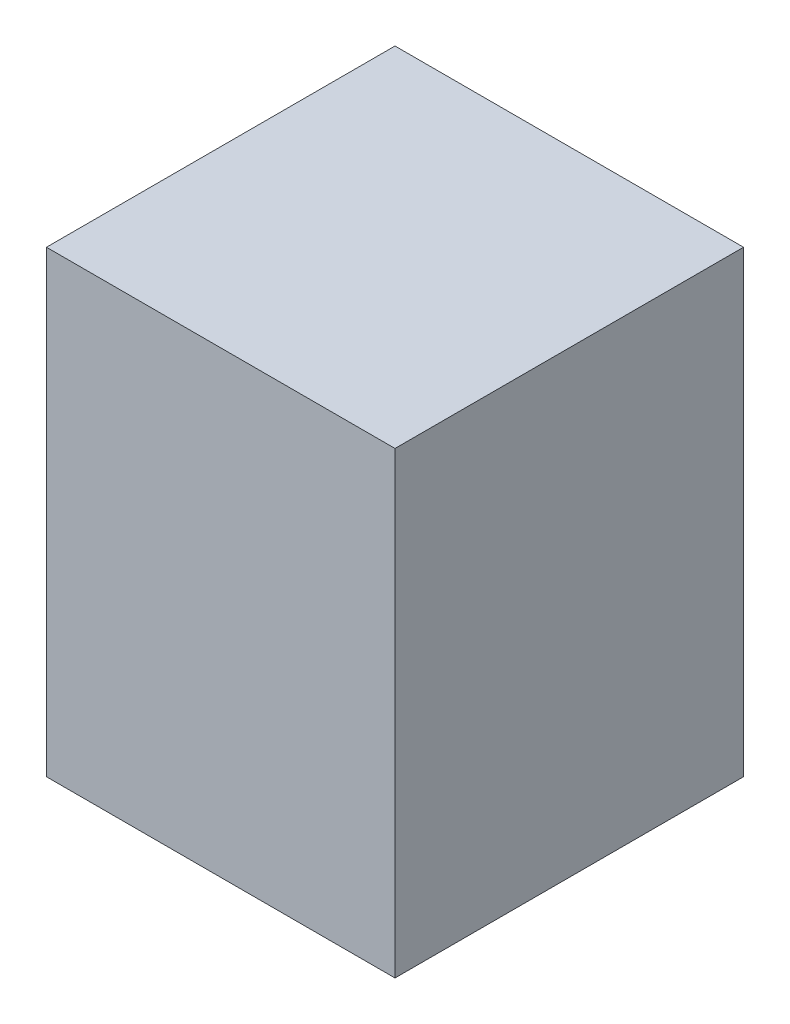
ISO-10303-21;
HEADER;
FILE_DESCRIPTION(('STEP AP214'),'2;1');
FILE_NAME('part.step','',(''),(''),'','','');
FILE_SCHEMA(('AUTOMOTIVE_DESIGN { 1 0 10303 214 1 1 1 1 }'));
ENDSEC;
DATA;
#1=APPLICATION_CONTEXT('core data for automotive mechanical design processes');
#2=APPLICATION_PROTOCOL_DEFINITION('international standard','automotive_design',2000,#1);
#3=PRODUCT_CONTEXT('',#1,'mechanical');
#4=PRODUCT('Part','Part','',(#3));
#5=PRODUCT_RELATED_PRODUCT_CATEGORY('part','',(#4));
#6=PRODUCT_DEFINITION_FORMATION('','',#4);
#7=PRODUCT_DEFINITION_CONTEXT('part definition',#1,'design');
#8=PRODUCT_DEFINITION('design','',#6,#7);
#9=PRODUCT_DEFINITION_SHAPE('','',#8);
#10=(LENGTH_UNIT() NAMED_UNIT(*) SI_UNIT(.MILLI.,.METRE.));
#11=(NAMED_UNIT(*) PLANE_ANGLE_UNIT() SI_UNIT($,.RADIAN.));
#12=(NAMED_UNIT(*) SI_UNIT($,.STERADIAN.) SOLID_ANGLE_UNIT());
#13=UNCERTAINTY_MEASURE_WITH_UNIT(LENGTH_MEASURE(1.E-05),#10,'distance_accuracy_value','');
#14=(GEOMETRIC_REPRESENTATION_CONTEXT(3) GLOBAL_UNCERTAINTY_ASSIGNED_CONTEXT((#13)) GLOBAL_UNIT_ASSIGNED_CONTEXT((#10,
#11,#12)) REPRESENTATION_CONTEXT('',''));
#15=CARTESIAN_POINT('',(0.,0.,0.));
#16=DIRECTION('',(0.,0.,1.));
#17=DIRECTION('',(1.,0.,0.));
#18=AXIS2_PLACEMENT_3D('',#15,#16,#17);
#19=CARTESIAN_POINT('',(24.13,-31.75,24.13));
#20=DIRECTION('',(-1.,0.,0.));
#21=DIRECTION('',(0.,0.,1.));
#22=AXIS2_PLACEMENT_3D('',#19,#20,#21);
#23=PLANE('',#22);
#24=DIRECTION('',(0.,1.,0.));
#25=VECTOR('',#24,1.);
#26=CARTESIAN_POINT('',(24.13,-31.75,-24.13));
#27=LINE('',#26,#25);
#28=CARTESIAN_POINT('',(24.13,-31.75,-24.13));
#29=VERTEX_POINT('',#28);
#30=CARTESIAN_POINT('',(24.13,31.75,-24.13));
#31=VERTEX_POINT('',#30);
#32=EDGE_CURVE('E99',#29,#31,#27,.T.);
#33=ORIENTED_EDGE('',*,*,#32,.T.);
#34=DIRECTION('',(0.,0.,-1.));
#35=VECTOR('',#34,1.);
#36=CARTESIAN_POINT('',(24.13,31.75,24.13));
#37=LINE('',#36,#35);
#38=CARTESIAN_POINT('',(24.13,31.75,24.13));
#39=VERTEX_POINT('',#38);
#40=EDGE_CURVE('E11',#39,#31,#37,.T.);
#41=ORIENTED_EDGE('',*,*,#40,.F.);
#42=DIRECTION('',(0.,1.,0.));
#43=VECTOR('',#42,1.);
#44=CARTESIAN_POINT('',(24.13,-31.75,24.13));
#45=LINE('',#44,#43);
#46=CARTESIAN_POINT('',(24.13,-31.75,24.13));
#47=VERTEX_POINT('',#46);
#48=EDGE_CURVE('E87',#47,#39,#45,.T.);
#49=ORIENTED_EDGE('',*,*,#48,.F.);
#50=DIRECTION('',(0.,0.,-1.));
#51=VECTOR('',#50,1.);
#52=CARTESIAN_POINT('',(24.13,-31.75,24.13));
#53=LINE('',#52,#51);
#54=EDGE_CURVE('E95',#47,#29,#53,.T.);
#55=ORIENTED_EDGE('',*,*,#54,.T.);
#56=EDGE_LOOP('',(#33,#41,#49,#55));
#57=FACE_BOUND('',#56,.T.);
#58=ADVANCED_FACE('F36',(#57),#23,.F.);
#59=CARTESIAN_POINT('',(-24.13,31.75,24.13));
#60=DIRECTION('',(0.,-1.,0.));
#61=DIRECTION('',(0.,0.,-1.));
#62=AXIS2_PLACEMENT_3D('',#59,#60,#61);
#63=PLANE('',#62);
#64=DIRECTION('',(-1.,0.,0.));
#65=VECTOR('',#64,1.);
#66=CARTESIAN_POINT('',(-24.13,31.75,-24.13));
#67=LINE('',#66,#65);
#68=CARTESIAN_POINT('',(-24.13,31.75,-24.13));
#69=VERTEX_POINT('',#68);
#70=EDGE_CURVE('E91',#31,#69,#67,.T.);
#71=ORIENTED_EDGE('',*,*,#70,.T.);
#72=DIRECTION('',(0.,0.,-1.));
#73=VECTOR('',#72,1.);
#74=CARTESIAN_POINT('',(-24.13,31.75,24.13));
#75=LINE('',#74,#73);
#76=CARTESIAN_POINT('',(-24.13,31.75,24.13));
#77=VERTEX_POINT('',#76);
#78=EDGE_CURVE('E44',#77,#69,#75,.T.);
#79=ORIENTED_EDGE('',*,*,#78,.F.);
#80=DIRECTION('',(-1.,0.,0.));
#81=VECTOR('',#80,1.);
#82=CARTESIAN_POINT('',(-24.13,31.75,24.13));
#83=LINE('',#82,#81);
#84=EDGE_CURVE('E82',#39,#77,#83,.T.);
#85=ORIENTED_EDGE('',*,*,#84,.F.);
#86=ORIENTED_EDGE('',*,*,#40,.T.);
#87=EDGE_LOOP('',(#71,#79,#85,#86));
#88=FACE_BOUND('',#87,.T.);
#89=ADVANCED_FACE('F90',(#88),#63,.F.);
#90=CARTESIAN_POINT('',(-24.13,-31.75,24.13));
#91=DIRECTION('',(1.,0.,0.));
#92=DIRECTION('',(0.,0.,-1.));
#93=AXIS2_PLACEMENT_3D('',#90,#91,#92);
#94=PLANE('',#93);
#95=DIRECTION('',(0.,-1.,0.));
#96=VECTOR('',#95,1.);
#97=CARTESIAN_POINT('',(-24.13,-31.75,-24.13));
#98=LINE('',#97,#96);
#99=CARTESIAN_POINT('',(-24.13,-31.75,-24.13));
#100=VERTEX_POINT('',#99);
#101=EDGE_CURVE('E69',#69,#100,#98,.T.);
#102=ORIENTED_EDGE('',*,*,#101,.T.);
#103=DIRECTION('',(0.,0.,-1.));
#104=VECTOR('',#103,1.);
#105=CARTESIAN_POINT('',(-24.13,-31.75,24.13));
#106=LINE('',#105,#104);
#107=CARTESIAN_POINT('',(-24.13,-31.75,24.13));
#108=VERTEX_POINT('',#107);
#109=EDGE_CURVE('E92',#108,#100,#106,.T.);
#110=ORIENTED_EDGE('',*,*,#109,.F.);
#111=DIRECTION('',(0.,-1.,0.));
#112=VECTOR('',#111,1.);
#113=CARTESIAN_POINT('',(-24.13,-31.75,24.13));
#114=LINE('',#113,#112);
#115=EDGE_CURVE('E85',#77,#108,#114,.T.);
#116=ORIENTED_EDGE('',*,*,#115,.F.);
#117=ORIENTED_EDGE('',*,*,#78,.T.);
#118=EDGE_LOOP('',(#102,#110,#116,#117));
#119=FACE_BOUND('',#118,.T.);
#120=ADVANCED_FACE('F93',(#119),#94,.F.);
#121=CARTESIAN_POINT('',(-24.13,-31.75,24.13));
#122=DIRECTION('',(0.,1.,0.));
#123=DIRECTION('',(0.,0.,1.));
#124=AXIS2_PLACEMENT_3D('',#121,#122,#123);
#125=PLANE('',#124);
#126=DIRECTION('',(1.,0.,0.));
#127=VECTOR('',#126,1.);
#128=CARTESIAN_POINT('',(-24.13,-31.75,-24.13));
#129=LINE('',#128,#127);
#130=EDGE_CURVE('E75',#100,#29,#129,.T.);
#131=ORIENTED_EDGE('',*,*,#130,.T.);
#132=ORIENTED_EDGE('',*,*,#54,.F.);
#133=DIRECTION('',(1.,0.,0.));
#134=VECTOR('',#133,1.);
#135=CARTESIAN_POINT('',(-24.13,-31.75,24.13));
#136=LINE('',#135,#134);
#137=EDGE_CURVE('E52',#108,#47,#136,.T.);
#138=ORIENTED_EDGE('',*,*,#137,.F.);
#139=ORIENTED_EDGE('',*,*,#109,.T.);
#140=EDGE_LOOP('',(#131,#132,#138,#139));
#141=FACE_BOUND('',#140,.T.);
#142=ADVANCED_FACE('F106',(#141),#125,.F.);
#143=CARTESIAN_POINT('',(0.,0.,24.13));
#144=DIRECTION('',(0.,0.,-1.));
#145=DIRECTION('',(-1.,0.,0.));
#146=AXIS2_PLACEMENT_3D('',#143,#144,#145);
#147=PLANE('',#146);
#148=ORIENTED_EDGE('',*,*,#48,.T.);
#149=ORIENTED_EDGE('',*,*,#84,.T.);
#150=ORIENTED_EDGE('',*,*,#115,.T.);
#151=ORIENTED_EDGE('',*,*,#137,.T.);
#152=EDGE_LOOP('',(#148,#149,#150,#151));
#153=FACE_BOUND('',#152,.T.);
#154=ADVANCED_FACE('F83',(#153),#147,.F.);
#155=CARTESIAN_POINT('',(0.,0.,-24.13));
#156=DIRECTION('',(0.,0.,-1.));
#157=DIRECTION('',(-1.,0.,0.));
#158=AXIS2_PLACEMENT_3D('',#155,#156,#157);
#159=PLANE('',#158);
#160=ORIENTED_EDGE('',*,*,#32,.F.);
#161=ORIENTED_EDGE('',*,*,#130,.F.);
#162=ORIENTED_EDGE('',*,*,#101,.F.);
#163=ORIENTED_EDGE('',*,*,#70,.F.);
#164=EDGE_LOOP('',(#160,#161,#162,#163));
#165=FACE_BOUND('',#164,.T.);
#166=ADVANCED_FACE('F109',(#165),#159,.T.);
#167=CLOSED_SHELL('',(#58,#89,#120,#142,#154,#166));
#168=MANIFOLD_SOLID_BREP('B2',#167);
#169=ADVANCED_BREP_SHAPE_REPRESENTATION('',(#18,#168),#14);
#170=SHAPE_DEFINITION_REPRESENTATION(#9,#169);
ENDSEC;
END-ISO-10303-21;
